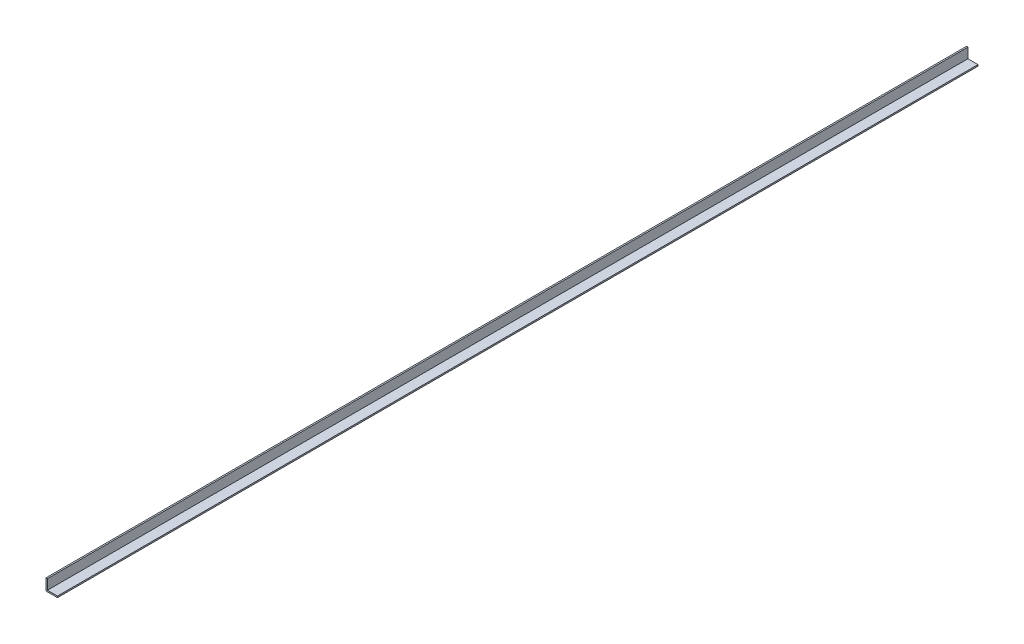
ISO-10303-21;
HEADER;
FILE_DESCRIPTION(('STEP AP214'),'2;1');
FILE_NAME('part.step','',(''),(''),'','','');
FILE_SCHEMA(('AUTOMOTIVE_DESIGN { 1 0 10303 214 1 1 1 1 }'));
ENDSEC;
DATA;
#1=APPLICATION_CONTEXT('core data for automotive mechanical design processes');
#2=APPLICATION_PROTOCOL_DEFINITION('international standard','automotive_design',2000,#1);
#3=PRODUCT_CONTEXT('',#1,'mechanical');
#4=PRODUCT('Part','Part','',(#3));
#5=PRODUCT_RELATED_PRODUCT_CATEGORY('part','',(#4));
#6=PRODUCT_DEFINITION_FORMATION('','',#4);
#7=PRODUCT_DEFINITION_CONTEXT('part definition',#1,'design');
#8=PRODUCT_DEFINITION('design','',#6,#7);
#9=PRODUCT_DEFINITION_SHAPE('','',#8);
#10=(LENGTH_UNIT() NAMED_UNIT(*) SI_UNIT(.MILLI.,.METRE.));
#11=(NAMED_UNIT(*) PLANE_ANGLE_UNIT() SI_UNIT($,.RADIAN.));
#12=(NAMED_UNIT(*) SI_UNIT($,.STERADIAN.) SOLID_ANGLE_UNIT());
#13=UNCERTAINTY_MEASURE_WITH_UNIT(LENGTH_MEASURE(1.E-05),#10,'distance_accuracy_value','');
#14=(GEOMETRIC_REPRESENTATION_CONTEXT(3) GLOBAL_UNCERTAINTY_ASSIGNED_CONTEXT((#13)) GLOBAL_UNIT_ASSIGNED_CONTEXT((#10,
#11,#12)) REPRESENTATION_CONTEXT('',''));
#15=CARTESIAN_POINT('',(0.,0.,0.));
#16=DIRECTION('',(0.,0.,1.));
#17=DIRECTION('',(1.,0.,0.));
#18=AXIS2_PLACEMENT_3D('',#15,#16,#17);
#19=CARTESIAN_POINT('',(9.53,76.2,-6100.));
#20=DIRECTION('',(0.,1.,0.));
#21=DIRECTION('',(0.,0.,1.));
#22=AXIS2_PLACEMENT_3D('',#19,#20,#21);
#23=PLANE('',#22);
#24=DIRECTION('',(-1.,0.,0.));
#25=VECTOR('',#24,1.);
#26=CARTESIAN_POINT('',(9.53,76.2,0.));
#27=LINE('',#26,#25);
#28=CARTESIAN_POINT('',(9.53,76.2,0.));
#29=VERTEX_POINT('',#28);
#30=CARTESIAN_POINT('',(0.,76.2,0.));
#31=VERTEX_POINT('',#30);
#32=EDGE_CURVE('E118',#29,#31,#27,.T.);
#33=ORIENTED_EDGE('',*,*,#32,.F.);
#34=DIRECTION('',(0.,0.,1.));
#35=VECTOR('',#34,1.);
#36=CARTESIAN_POINT('',(9.53,76.2,-6100.));
#37=LINE('',#36,#35);
#38=CARTESIAN_POINT('',(9.53,76.2,-6100.));
#39=VERTEX_POINT('',#38);
#40=EDGE_CURVE('E11',#39,#29,#37,.T.);
#41=ORIENTED_EDGE('',*,*,#40,.F.);
#42=DIRECTION('',(-1.,0.,0.));
#43=VECTOR('',#42,1.);
#44=CARTESIAN_POINT('',(9.53,76.2,-6100.));
#45=LINE('',#44,#43);
#46=CARTESIAN_POINT('',(0.,76.2,-6100.));
#47=VERTEX_POINT('',#46);
#48=EDGE_CURVE('E132',#39,#47,#45,.T.);
#49=ORIENTED_EDGE('',*,*,#48,.T.);
#50=DIRECTION('',(0.,0.,1.));
#51=VECTOR('',#50,1.);
#52=CARTESIAN_POINT('',(0.,76.2,-6100.));
#53=LINE('',#52,#51);
#54=EDGE_CURVE('E36',#47,#31,#53,.T.);
#55=ORIENTED_EDGE('',*,*,#54,.T.);
#56=EDGE_LOOP('',(#33,#41,#49,#55));
#57=FACE_BOUND('',#56,.T.);
#58=ADVANCED_FACE('F33',(#57),#23,.T.);
#59=CARTESIAN_POINT('',(9.53,9.52999999999999,-6100.));
#60=DIRECTION('',(1.,0.,0.));
#61=DIRECTION('',(0.,0.,-1.));
#62=AXIS2_PLACEMENT_3D('',#59,#60,#61);
#63=PLANE('',#62);
#64=DIRECTION('',(0.,1.,0.));
#65=VECTOR('',#64,1.);
#66=CARTESIAN_POINT('',(9.53,9.52999999999999,0.));
#67=LINE('',#66,#65);
#68=CARTESIAN_POINT('',(9.53,9.52999999999999,0.));
#69=VERTEX_POINT('',#68);
#70=EDGE_CURVE('E130',#69,#29,#67,.T.);
#71=ORIENTED_EDGE('',*,*,#70,.F.);
#72=DIRECTION('',(0.,0.,1.));
#73=VECTOR('',#72,1.);
#74=CARTESIAN_POINT('',(9.53,9.52999999999999,-6100.));
#75=LINE('',#74,#73);
#76=CARTESIAN_POINT('',(9.53,9.52999999999999,-6100.));
#77=VERTEX_POINT('',#76);
#78=EDGE_CURVE('E42',#77,#69,#75,.T.);
#79=ORIENTED_EDGE('',*,*,#78,.F.);
#80=DIRECTION('',(0.,1.,0.));
#81=VECTOR('',#80,1.);
#82=CARTESIAN_POINT('',(9.53,9.52999999999999,-6100.));
#83=LINE('',#82,#81);
#84=EDGE_CURVE('E108',#77,#39,#83,.T.);
#85=ORIENTED_EDGE('',*,*,#84,.T.);
#86=ORIENTED_EDGE('',*,*,#40,.T.);
#87=EDGE_LOOP('',(#71,#79,#85,#86));
#88=FACE_BOUND('',#87,.T.);
#89=ADVANCED_FACE('F140',(#88),#63,.T.);
#90=CARTESIAN_POINT('',(76.2,9.53,-6100.));
#91=DIRECTION('',(0.,1.,0.));
#92=DIRECTION('',(-1.,0.,0.));
#93=AXIS2_PLACEMENT_3D('',#90,#91,#92);
#94=PLANE('',#93);
#95=DIRECTION('',(-1.,0.,0.));
#96=VECTOR('',#95,1.);
#97=CARTESIAN_POINT('',(76.2,9.53,0.));
#98=LINE('',#97,#96);
#99=CARTESIAN_POINT('',(76.2,9.53,0.));
#100=VERTEX_POINT('',#99);
#101=EDGE_CURVE('E95',#100,#69,#98,.T.);
#102=ORIENTED_EDGE('',*,*,#101,.F.);
#103=DIRECTION('',(0.,0.,1.));
#104=VECTOR('',#103,1.);
#105=CARTESIAN_POINT('',(76.2,9.53,-6100.));
#106=LINE('',#105,#104);
#107=CARTESIAN_POINT('',(76.2,9.53,-6100.));
#108=VERTEX_POINT('',#107);
#109=EDGE_CURVE('E90',#108,#100,#106,.T.);
#110=ORIENTED_EDGE('',*,*,#109,.F.);
#111=DIRECTION('',(-1.,0.,0.));
#112=VECTOR('',#111,1.);
#113=CARTESIAN_POINT('',(76.2,9.53,-6100.));
#114=LINE('',#113,#112);
#115=EDGE_CURVE('E93',#108,#77,#114,.T.);
#116=ORIENTED_EDGE('',*,*,#115,.T.);
#117=ORIENTED_EDGE('',*,*,#78,.T.);
#118=EDGE_LOOP('',(#102,#110,#116,#117));
#119=FACE_BOUND('',#118,.T.);
#120=ADVANCED_FACE('F92',(#119),#94,.T.);
#121=CARTESIAN_POINT('',(76.2,0.,-6100.));
#122=DIRECTION('',(1.,0.,0.));
#123=DIRECTION('',(0.,0.,-1.));
#124=AXIS2_PLACEMENT_3D('',#121,#122,#123);
#125=PLANE('',#124);
#126=DIRECTION('',(0.,1.,0.));
#127=VECTOR('',#126,1.);
#128=CARTESIAN_POINT('',(76.2,0.,0.));
#129=LINE('',#128,#127);
#130=CARTESIAN_POINT('',(76.2,0.,0.));
#131=VERTEX_POINT('',#130);
#132=EDGE_CURVE('E127',#131,#100,#129,.T.);
#133=ORIENTED_EDGE('',*,*,#132,.F.);
#134=DIRECTION('',(0.,0.,1.));
#135=VECTOR('',#134,1.);
#136=CARTESIAN_POINT('',(76.2,0.,-6100.));
#137=LINE('',#136,#135);
#138=CARTESIAN_POINT('',(76.2,0.,-6100.));
#139=VERTEX_POINT('',#138);
#140=EDGE_CURVE('E100',#139,#131,#137,.T.);
#141=ORIENTED_EDGE('',*,*,#140,.F.);
#142=DIRECTION('',(0.,1.,0.));
#143=VECTOR('',#142,1.);
#144=CARTESIAN_POINT('',(76.2,0.,-6100.));
#145=LINE('',#144,#143);
#146=EDGE_CURVE('E106',#139,#108,#145,.T.);
#147=ORIENTED_EDGE('',*,*,#146,.T.);
#148=ORIENTED_EDGE('',*,*,#109,.T.);
#149=EDGE_LOOP('',(#133,#141,#147,#148));
#150=FACE_BOUND('',#149,.T.);
#151=ADVANCED_FACE('F110',(#150),#125,.T.);
#152=CARTESIAN_POINT('',(0.,0.,-6100.));
#153=DIRECTION('',(0.,-1.,0.));
#154=DIRECTION('',(0.,0.,-1.));
#155=AXIS2_PLACEMENT_3D('',#152,#153,#154);
#156=PLANE('',#155);
#157=DIRECTION('',(1.,0.,0.));
#158=VECTOR('',#157,1.);
#159=CARTESIAN_POINT('',(0.,0.,0.));
#160=LINE('',#159,#158);
#161=CARTESIAN_POINT('',(0.,0.,0.));
#162=VERTEX_POINT('',#161);
#163=EDGE_CURVE('E124',#162,#131,#160,.T.);
#164=ORIENTED_EDGE('',*,*,#163,.F.);
#165=DIRECTION('',(0.,0.,1.));
#166=VECTOR('',#165,1.);
#167=CARTESIAN_POINT('',(0.,0.,-6100.));
#168=LINE('',#167,#166);
#169=CARTESIAN_POINT('',(0.,0.,-6100.));
#170=VERTEX_POINT('',#169);
#171=EDGE_CURVE('E135',#170,#162,#168,.T.);
#172=ORIENTED_EDGE('',*,*,#171,.F.);
#173=DIRECTION('',(1.,0.,0.));
#174=VECTOR('',#173,1.);
#175=CARTESIAN_POINT('',(0.,0.,-6100.));
#176=LINE('',#175,#174);
#177=EDGE_CURVE('E111',#170,#139,#176,.T.);
#178=ORIENTED_EDGE('',*,*,#177,.T.);
#179=ORIENTED_EDGE('',*,*,#140,.T.);
#180=EDGE_LOOP('',(#164,#172,#178,#179));
#181=FACE_BOUND('',#180,.T.);
#182=ADVANCED_FACE('F153',(#181),#156,.T.);
#183=CARTESIAN_POINT('',(0.,76.2,-6100.));
#184=DIRECTION('',(-1.,0.,0.));
#185=DIRECTION('',(0.,-1.,0.));
#186=AXIS2_PLACEMENT_3D('',#183,#184,#185);
#187=PLANE('',#186);
#188=DIRECTION('',(0.,-1.,0.));
#189=VECTOR('',#188,1.);
#190=CARTESIAN_POINT('',(0.,76.2,0.));
#191=LINE('',#190,#189);
#192=EDGE_CURVE('E121',#31,#162,#191,.T.);
#193=ORIENTED_EDGE('',*,*,#192,.F.);
#194=ORIENTED_EDGE('',*,*,#54,.F.);
#195=DIRECTION('',(0.,-1.,0.));
#196=VECTOR('',#195,1.);
#197=CARTESIAN_POINT('',(0.,76.2,-6100.));
#198=LINE('',#197,#196);
#199=EDGE_CURVE('E113',#47,#170,#198,.T.);
#200=ORIENTED_EDGE('',*,*,#199,.T.);
#201=ORIENTED_EDGE('',*,*,#171,.T.);
#202=EDGE_LOOP('',(#193,#194,#200,#201));
#203=FACE_BOUND('',#202,.T.);
#204=ADVANCED_FACE('F137',(#203),#187,.T.);
#205=CARTESIAN_POINT('',(0.,0.,-6100.));
#206=DIRECTION('',(0.,0.,1.));
#207=DIRECTION('',(1.,0.,0.));
#208=AXIS2_PLACEMENT_3D('',#205,#206,#207);
#209=PLANE('',#208);
#210=ORIENTED_EDGE('',*,*,#48,.F.);
#211=ORIENTED_EDGE('',*,*,#84,.F.);
#212=ORIENTED_EDGE('',*,*,#115,.F.);
#213=ORIENTED_EDGE('',*,*,#146,.F.);
#214=ORIENTED_EDGE('',*,*,#177,.F.);
#215=ORIENTED_EDGE('',*,*,#199,.F.);
#216=EDGE_LOOP('',(#210,#211,#212,#213,#214,#215));
#217=FACE_BOUND('',#216,.T.);
#218=ADVANCED_FACE('F104',(#217),#209,.F.);
#219=CARTESIAN_POINT('',(0.,0.,0.));
#220=DIRECTION('',(0.,0.,1.));
#221=DIRECTION('',(1.,0.,0.));
#222=AXIS2_PLACEMENT_3D('',#219,#220,#221);
#223=PLANE('',#222);
#224=ORIENTED_EDGE('',*,*,#32,.T.);
#225=ORIENTED_EDGE('',*,*,#192,.T.);
#226=ORIENTED_EDGE('',*,*,#163,.T.);
#227=ORIENTED_EDGE('',*,*,#132,.T.);
#228=ORIENTED_EDGE('',*,*,#101,.T.);
#229=ORIENTED_EDGE('',*,*,#70,.T.);
#230=EDGE_LOOP('',(#224,#225,#226,#227,#228,#229));
#231=FACE_BOUND('',#230,.T.);
#232=ADVANCED_FACE('F139',(#231),#223,.T.);
#233=CLOSED_SHELL('',(#58,#89,#120,#151,#182,#204,#218,#232));
#234=MANIFOLD_SOLID_BREP('B2',#233);
#235=ADVANCED_BREP_SHAPE_REPRESENTATION('',(#18,#234),#14);
#236=SHAPE_DEFINITION_REPRESENTATION(#9,#235);
ENDSEC;
END-ISO-10303-21;
